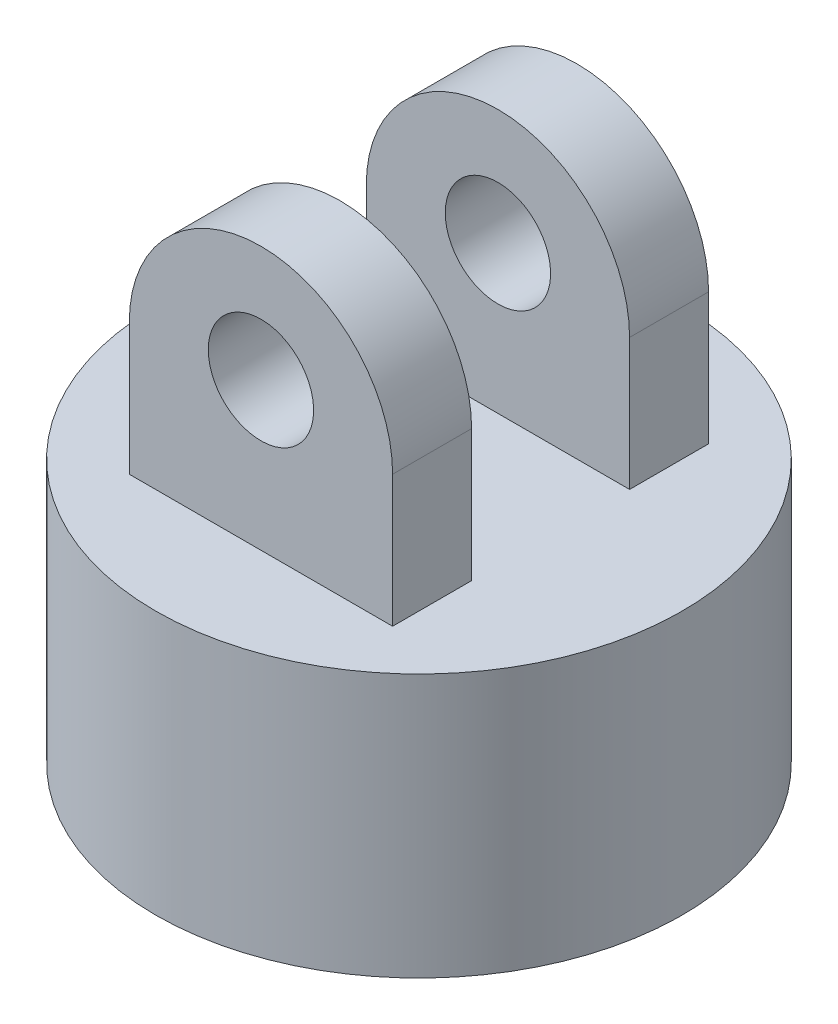
ISO-10303-21;
HEADER;
FILE_DESCRIPTION(('STEP AP214'),'2;1');
FILE_NAME('part.step','',(''),(''),'','','');
FILE_SCHEMA(('AUTOMOTIVE_DESIGN { 1 0 10303 214 1 1 1 1 }'));
ENDSEC;
DATA;
#1=APPLICATION_CONTEXT('core data for automotive mechanical design processes');
#2=APPLICATION_PROTOCOL_DEFINITION('international standard','automotive_design',2000,#1);
#3=PRODUCT_CONTEXT('',#1,'mechanical');
#4=PRODUCT('Part','Part','',(#3));
#5=PRODUCT_RELATED_PRODUCT_CATEGORY('part','',(#4));
#6=PRODUCT_DEFINITION_FORMATION('','',#4);
#7=PRODUCT_DEFINITION_CONTEXT('part definition',#1,'design');
#8=PRODUCT_DEFINITION('design','',#6,#7);
#9=PRODUCT_DEFINITION_SHAPE('','',#8);
#10=(LENGTH_UNIT() NAMED_UNIT(*) SI_UNIT(.MILLI.,.METRE.));
#11=(NAMED_UNIT(*) PLANE_ANGLE_UNIT() SI_UNIT($,.RADIAN.));
#12=(NAMED_UNIT(*) SI_UNIT($,.STERADIAN.) SOLID_ANGLE_UNIT());
#13=UNCERTAINTY_MEASURE_WITH_UNIT(LENGTH_MEASURE(1.E-05),#10,'distance_accuracy_value','');
#14=(GEOMETRIC_REPRESENTATION_CONTEXT(3) GLOBAL_UNCERTAINTY_ASSIGNED_CONTEXT((#13)) GLOBAL_UNIT_ASSIGNED_CONTEXT((#10,
#11,#12)) REPRESENTATION_CONTEXT('',''));
#15=CARTESIAN_POINT('',(0.,0.,0.));
#16=DIRECTION('',(0.,0.,1.));
#17=DIRECTION('',(1.,0.,0.));
#18=AXIS2_PLACEMENT_3D('',#15,#16,#17);
#19=CARTESIAN_POINT('',(0.,75.,15.));
#20=DIRECTION('',(0.,0.,-1.));
#21=DIRECTION('',(-1.,0.,0.));
#22=AXIS2_PLACEMENT_3D('',#19,#20,#21);
#23=CYLINDRICAL_SURFACE('',#22,25.);
#24=DIRECTION('',(0.,0.,1.));
#25=VECTOR('',#24,1.);
#26=CARTESIAN_POINT('',(25.,75.,15.));
#27=LINE('',#26,#25);
#28=CARTESIAN_POINT('',(25.,75.,15.));
#29=VERTEX_POINT('',#28);
#30=CARTESIAN_POINT('',(25.,75.,30.));
#31=VERTEX_POINT('',#30);
#32=EDGE_CURVE('E170',#29,#31,#27,.T.);
#33=ORIENTED_EDGE('',*,*,#32,.F.);
#34=CARTESIAN_POINT('',(0.,75.,15.));
#35=DIRECTION('',(0.,0.,1.));
#36=DIRECTION('',(1.,0.,0.));
#37=AXIS2_PLACEMENT_3D('',#34,#35,#36);
#38=CIRCLE('',#37,25.);
#39=CARTESIAN_POINT('',(-25.,75.,15.));
#40=VERTEX_POINT('',#39);
#41=EDGE_CURVE('E46',#40,#29,#38,.F.);
#42=ORIENTED_EDGE('',*,*,#41,.F.);
#43=DIRECTION('',(0.,0.,1.));
#44=VECTOR('',#43,1.);
#45=CARTESIAN_POINT('',(-25.,75.,15.));
#46=LINE('',#45,#44);
#47=CARTESIAN_POINT('',(-25.,75.,30.));
#48=VERTEX_POINT('',#47);
#49=EDGE_CURVE('E107',#48,#40,#46,.F.);
#50=ORIENTED_EDGE('',*,*,#49,.F.);
#51=CARTESIAN_POINT('',(0.,75.,30.));
#52=DIRECTION('',(0.,0.,-1.));
#53=DIRECTION('',(-1.,0.,0.));
#54=AXIS2_PLACEMENT_3D('',#51,#52,#53);
#55=CIRCLE('',#54,25.);
#56=EDGE_CURVE('E11',#31,#48,#55,.F.);
#57=ORIENTED_EDGE('',*,*,#56,.F.);
#58=EDGE_LOOP('',(#33,#42,#50,#57));
#59=FACE_BOUND('',#58,.T.);
#60=ADVANCED_FACE('F38',(#59),#23,.T.);
#61=CARTESIAN_POINT('',(0.,75.,-30.));
#62=DIRECTION('',(0.,0.,-1.));
#63=DIRECTION('',(-1.,0.,0.));
#64=AXIS2_PLACEMENT_3D('',#61,#62,#63);
#65=CYLINDRICAL_SURFACE('',#64,25.);
#66=DIRECTION('',(0.,0.,-1.));
#67=VECTOR('',#66,1.);
#68=CARTESIAN_POINT('',(25.,75.,-30.));
#69=LINE('',#68,#67);
#70=CARTESIAN_POINT('',(25.,75.,-30.));
#71=VERTEX_POINT('',#70);
#72=CARTESIAN_POINT('',(25.,75.,-15.));
#73=VERTEX_POINT('',#72);
#74=EDGE_CURVE('E158',#71,#73,#69,.F.);
#75=ORIENTED_EDGE('',*,*,#74,.F.);
#76=CARTESIAN_POINT('',(0.,75.,-30.));
#77=DIRECTION('',(0.,0.,1.));
#78=DIRECTION('',(1.,0.,0.));
#79=AXIS2_PLACEMENT_3D('',#76,#77,#78);
#80=CIRCLE('',#79,25.);
#81=CARTESIAN_POINT('',(-25.,75.,-30.));
#82=VERTEX_POINT('',#81);
#83=EDGE_CURVE('E166',#82,#71,#80,.F.);
#84=ORIENTED_EDGE('',*,*,#83,.F.);
#85=DIRECTION('',(0.,0.,-1.));
#86=VECTOR('',#85,1.);
#87=CARTESIAN_POINT('',(-25.,75.,-15.));
#88=LINE('',#87,#86);
#89=CARTESIAN_POINT('',(-25.,75.,-15.));
#90=VERTEX_POINT('',#89);
#91=EDGE_CURVE('E163',#90,#82,#88,.T.);
#92=ORIENTED_EDGE('',*,*,#91,.F.);
#93=CARTESIAN_POINT('',(0.,75.,-15.));
#94=DIRECTION('',(0.,0.,-1.));
#95=DIRECTION('',(-1.,0.,0.));
#96=AXIS2_PLACEMENT_3D('',#93,#94,#95);
#97=CIRCLE('',#96,25.);
#98=EDGE_CURVE('E168',#73,#90,#97,.F.);
#99=ORIENTED_EDGE('',*,*,#98,.F.);
#100=EDGE_LOOP('',(#75,#84,#92,#99));
#101=FACE_BOUND('',#100,.T.);
#102=ADVANCED_FACE('F188',(#101),#65,.T.);
#103=CARTESIAN_POINT('',(0.,50.,0.));
#104=DIRECTION('',(0.,1.,0.));
#105=DIRECTION('',(0.,0.,1.));
#106=AXIS2_PLACEMENT_3D('',#103,#104,#105);
#107=PLANE('',#106);
#108=CARTESIAN_POINT('',(0.,50.,0.));
#109=DIRECTION('',(0.,1.,0.));
#110=DIRECTION('',(0.,0.,1.));
#111=AXIS2_PLACEMENT_3D('',#108,#109,#110);
#112=CIRCLE('',#111,50.);
#113=CARTESIAN_POINT('',(0.,50.,50.));
#114=VERTEX_POINT('',#113);
#115=EDGE_CURVE('E155',#114,#114,#112,.T.);
#116=ORIENTED_EDGE('',*,*,#115,.T.);
#117=EDGE_LOOP('',(#116));
#118=FACE_BOUND('',#117,.T.);
#119=DIRECTION('',(1.,0.,0.));
#120=VECTOR('',#119,1.);
#121=CARTESIAN_POINT('',(25.,50.,-15.));
#122=LINE('',#121,#120);
#123=CARTESIAN_POINT('',(-25.,50.,-15.));
#124=VERTEX_POINT('',#123);
#125=CARTESIAN_POINT('',(25.,50.,-15.));
#126=VERTEX_POINT('',#125);
#127=EDGE_CURVE('E137',#124,#126,#122,.T.);
#128=ORIENTED_EDGE('',*,*,#127,.F.);
#129=DIRECTION('',(0.,0.,1.));
#130=VECTOR('',#129,1.);
#131=CARTESIAN_POINT('',(-25.,50.,-15.));
#132=LINE('',#131,#130);
#133=CARTESIAN_POINT('',(-25.,50.,-30.));
#134=VERTEX_POINT('',#133);
#135=EDGE_CURVE('E109',#134,#124,#132,.T.);
#136=ORIENTED_EDGE('',*,*,#135,.F.);
#137=DIRECTION('',(-1.,0.,0.));
#138=VECTOR('',#137,1.);
#139=CARTESIAN_POINT('',(-25.,50.,-30.));
#140=LINE('',#139,#138);
#141=CARTESIAN_POINT('',(25.,50.,-30.));
#142=VERTEX_POINT('',#141);
#143=EDGE_CURVE('E143',#142,#134,#140,.T.);
#144=ORIENTED_EDGE('',*,*,#143,.F.);
#145=DIRECTION('',(0.,0.,-1.));
#146=VECTOR('',#145,1.);
#147=CARTESIAN_POINT('',(25.,50.,-30.));
#148=LINE('',#147,#146);
#149=EDGE_CURVE('E140',#126,#142,#148,.T.);
#150=ORIENTED_EDGE('',*,*,#149,.F.);
#151=EDGE_LOOP('',(#128,#136,#144,#150));
#152=FACE_BOUND('',#151,.T.);
#153=DIRECTION('',(0.,0.,1.));
#154=VECTOR('',#153,1.);
#155=CARTESIAN_POINT('',(-25.,50.,15.));
#156=LINE('',#155,#154);
#157=CARTESIAN_POINT('',(-25.,50.,15.));
#158=VERTEX_POINT('',#157);
#159=CARTESIAN_POINT('',(-25.,50.,30.));
#160=VERTEX_POINT('',#159);
#161=EDGE_CURVE('E105',#158,#160,#156,.T.);
#162=ORIENTED_EDGE('',*,*,#161,.F.);
#163=DIRECTION('',(-1.,0.,0.));
#164=VECTOR('',#163,1.);
#165=CARTESIAN_POINT('',(25.,50.,15.));
#166=LINE('',#165,#164);
#167=CARTESIAN_POINT('',(25.,50.,15.));
#168=VERTEX_POINT('',#167);
#169=EDGE_CURVE('E113',#168,#158,#166,.T.);
#170=ORIENTED_EDGE('',*,*,#169,.F.);
#171=DIRECTION('',(0.,0.,-1.));
#172=VECTOR('',#171,1.);
#173=CARTESIAN_POINT('',(25.,50.,30.));
#174=LINE('',#173,#172);
#175=CARTESIAN_POINT('',(25.,50.,30.));
#176=VERTEX_POINT('',#175);
#177=EDGE_CURVE('E126',#176,#168,#174,.T.);
#178=ORIENTED_EDGE('',*,*,#177,.F.);
#179=DIRECTION('',(1.,0.,0.));
#180=VECTOR('',#179,1.);
#181=CARTESIAN_POINT('',(-25.,50.,30.));
#182=LINE('',#181,#180);
#183=EDGE_CURVE('E124',#160,#176,#182,.T.);
#184=ORIENTED_EDGE('',*,*,#183,.F.);
#185=EDGE_LOOP('',(#162,#170,#178,#184));
#186=FACE_BOUND('',#185,.T.);
#187=ADVANCED_FACE('F122',(#118,#152,#186),#107,.T.);
#188=CARTESIAN_POINT('',(0.,50.,0.));
#189=DIRECTION('',(0.,-1.,0.));
#190=DIRECTION('',(0.,0.,-1.));
#191=AXIS2_PLACEMENT_3D('',#188,#189,#190);
#192=CYLINDRICAL_SURFACE('',#191,50.);
#193=ORIENTED_EDGE('',*,*,#115,.F.);
#194=EDGE_LOOP('',(#193));
#195=FACE_BOUND('',#194,.T.);
#196=CARTESIAN_POINT('',(0.,0.,0.));
#197=DIRECTION('',(0.,1.,0.));
#198=DIRECTION('',(0.,0.,1.));
#199=AXIS2_PLACEMENT_3D('',#196,#197,#198);
#200=CIRCLE('',#199,50.);
#201=CARTESIAN_POINT('',(0.,0.,50.));
#202=VERTEX_POINT('',#201);
#203=EDGE_CURVE('E154',#202,#202,#200,.T.);
#204=ORIENTED_EDGE('',*,*,#203,.T.);
#205=EDGE_LOOP('',(#204));
#206=FACE_BOUND('',#205,.T.);
#207=ADVANCED_FACE('F196',(#195,#206),#192,.T.);
#208=CARTESIAN_POINT('',(0.,0.,0.));
#209=DIRECTION('',(0.,1.,0.));
#210=DIRECTION('',(0.,0.,1.));
#211=AXIS2_PLACEMENT_3D('',#208,#209,#210);
#212=PLANE('',#211);
#213=ORIENTED_EDGE('',*,*,#203,.F.);
#214=EDGE_LOOP('',(#213));
#215=FACE_BOUND('',#214,.T.);
#216=ADVANCED_FACE('F206',(#215),#212,.F.);
#217=CARTESIAN_POINT('',(-25.,100.,-15.));
#218=DIRECTION('',(1.,0.,0.));
#219=DIRECTION('',(0.,0.,-1.));
#220=AXIS2_PLACEMENT_3D('',#217,#218,#219);
#221=PLANE('',#220);
#222=DIRECTION('',(0.,-1.,0.));
#223=VECTOR('',#222,1.);
#224=CARTESIAN_POINT('',(-25.,100.,-15.));
#225=LINE('',#224,#223);
#226=EDGE_CURVE('E152',#90,#124,#225,.T.);
#227=ORIENTED_EDGE('',*,*,#226,.F.);
#228=ORIENTED_EDGE('',*,*,#91,.T.);
#229=DIRECTION('',(0.,-1.,0.));
#230=VECTOR('',#229,1.);
#231=CARTESIAN_POINT('',(-25.,100.,-30.));
#232=LINE('',#231,#230);
#233=EDGE_CURVE('E146',#82,#134,#232,.T.);
#234=ORIENTED_EDGE('',*,*,#233,.T.);
#235=ORIENTED_EDGE('',*,*,#135,.T.);
#236=EDGE_LOOP('',(#227,#228,#234,#235));
#237=FACE_BOUND('',#236,.T.);
#238=ADVANCED_FACE('F209',(#237),#221,.F.);
#239=CARTESIAN_POINT('',(25.,100.,-15.));
#240=DIRECTION('',(0.,0.,-1.));
#241=DIRECTION('',(-1.,0.,0.));
#242=AXIS2_PLACEMENT_3D('',#239,#240,#241);
#243=PLANE('',#242);
#244=CARTESIAN_POINT('',(0.,78.,-15.));
#245=DIRECTION('',(0.,0.,-1.));
#246=DIRECTION('',(-1.,0.,0.));
#247=AXIS2_PLACEMENT_3D('',#244,#245,#246);
#248=CIRCLE('',#247,10.);
#249=CARTESIAN_POINT('',(-9.99999999999999,78.,-15.));
#250=VERTEX_POINT('',#249);
#251=EDGE_CURVE('E120',#250,#250,#248,.T.);
#252=ORIENTED_EDGE('',*,*,#251,.T.);
#253=EDGE_LOOP('',(#252));
#254=FACE_BOUND('',#253,.T.);
#255=DIRECTION('',(0.,-1.,0.));
#256=VECTOR('',#255,1.);
#257=CARTESIAN_POINT('',(25.,100.,-15.));
#258=LINE('',#257,#256);
#259=EDGE_CURVE('E150',#73,#126,#258,.T.);
#260=ORIENTED_EDGE('',*,*,#259,.F.);
#261=ORIENTED_EDGE('',*,*,#98,.T.);
#262=ORIENTED_EDGE('',*,*,#226,.T.);
#263=ORIENTED_EDGE('',*,*,#127,.T.);
#264=EDGE_LOOP('',(#260,#261,#262,#263));
#265=FACE_BOUND('',#264,.T.);
#266=ADVANCED_FACE('F214',(#254,#265),#243,.F.);
#267=CARTESIAN_POINT('',(25.,100.,-30.));
#268=DIRECTION('',(-1.,0.,0.));
#269=DIRECTION('',(0.,0.,1.));
#270=AXIS2_PLACEMENT_3D('',#267,#268,#269);
#271=PLANE('',#270);
#272=DIRECTION('',(0.,-1.,0.));
#273=VECTOR('',#272,1.);
#274=CARTESIAN_POINT('',(25.,100.,-30.));
#275=LINE('',#274,#273);
#276=EDGE_CURVE('E148',#71,#142,#275,.T.);
#277=ORIENTED_EDGE('',*,*,#276,.F.);
#278=ORIENTED_EDGE('',*,*,#74,.T.);
#279=ORIENTED_EDGE('',*,*,#259,.T.);
#280=ORIENTED_EDGE('',*,*,#149,.T.);
#281=EDGE_LOOP('',(#277,#278,#279,#280));
#282=FACE_BOUND('',#281,.T.);
#283=ADVANCED_FACE('F218',(#282),#271,.F.);
#284=CARTESIAN_POINT('',(-25.,100.,-30.));
#285=DIRECTION('',(0.,0.,1.));
#286=DIRECTION('',(1.,0.,0.));
#287=AXIS2_PLACEMENT_3D('',#284,#285,#286);
#288=PLANE('',#287);
#289=CARTESIAN_POINT('',(0.,78.,-30.));
#290=DIRECTION('',(0.,0.,-1.));
#291=DIRECTION('',(-1.,0.,0.));
#292=AXIS2_PLACEMENT_3D('',#289,#290,#291);
#293=CIRCLE('',#292,10.);
#294=CARTESIAN_POINT('',(-9.99999999999999,78.,-30.));
#295=VERTEX_POINT('',#294);
#296=EDGE_CURVE('E238',#295,#295,#293,.T.);
#297=ORIENTED_EDGE('',*,*,#296,.F.);
#298=EDGE_LOOP('',(#297));
#299=FACE_BOUND('',#298,.T.);
#300=ORIENTED_EDGE('',*,*,#233,.F.);
#301=ORIENTED_EDGE('',*,*,#83,.T.);
#302=ORIENTED_EDGE('',*,*,#276,.T.);
#303=ORIENTED_EDGE('',*,*,#143,.T.);
#304=EDGE_LOOP('',(#300,#301,#302,#303));
#305=FACE_BOUND('',#304,.T.);
#306=ADVANCED_FACE('F222',(#299,#305),#288,.F.);
#307=CARTESIAN_POINT('',(25.,100.,15.));
#308=DIRECTION('',(0.,0.,1.));
#309=DIRECTION('',(1.,0.,0.));
#310=AXIS2_PLACEMENT_3D('',#307,#308,#309);
#311=PLANE('',#310);
#312=CARTESIAN_POINT('',(0.,78.,15.));
#313=DIRECTION('',(0.,0.,1.));
#314=DIRECTION('',(1.,0.,0.));
#315=AXIS2_PLACEMENT_3D('',#312,#313,#314);
#316=CIRCLE('',#315,10.);
#317=CARTESIAN_POINT('',(10.,78.,15.));
#318=VERTEX_POINT('',#317);
#319=EDGE_CURVE('E233',#318,#318,#316,.T.);
#320=ORIENTED_EDGE('',*,*,#319,.T.);
#321=EDGE_LOOP('',(#320));
#322=FACE_BOUND('',#321,.T.);
#323=DIRECTION('',(0.,-1.,0.));
#324=VECTOR('',#323,1.);
#325=CARTESIAN_POINT('',(-25.,100.,15.));
#326=LINE('',#325,#324);
#327=EDGE_CURVE('E100',#40,#158,#326,.T.);
#328=ORIENTED_EDGE('',*,*,#327,.F.);
#329=ORIENTED_EDGE('',*,*,#41,.T.);
#330=DIRECTION('',(0.,-1.,0.));
#331=VECTOR('',#330,1.);
#332=CARTESIAN_POINT('',(25.,100.,15.));
#333=LINE('',#332,#331);
#334=EDGE_CURVE('E116',#29,#168,#333,.T.);
#335=ORIENTED_EDGE('',*,*,#334,.T.);
#336=ORIENTED_EDGE('',*,*,#169,.T.);
#337=EDGE_LOOP('',(#328,#329,#335,#336));
#338=FACE_BOUND('',#337,.T.);
#339=ADVANCED_FACE('F114',(#322,#338),#311,.F.);
#340=CARTESIAN_POINT('',(-25.,100.,15.));
#341=DIRECTION('',(1.,0.,0.));
#342=DIRECTION('',(0.,0.,-1.));
#343=AXIS2_PLACEMENT_3D('',#340,#341,#342);
#344=PLANE('',#343);
#345=DIRECTION('',(0.,-1.,0.));
#346=VECTOR('',#345,1.);
#347=CARTESIAN_POINT('',(-25.,100.,30.));
#348=LINE('',#347,#346);
#349=EDGE_CURVE('E110',#48,#160,#348,.T.);
#350=ORIENTED_EDGE('',*,*,#349,.F.);
#351=ORIENTED_EDGE('',*,*,#49,.T.);
#352=ORIENTED_EDGE('',*,*,#327,.T.);
#353=ORIENTED_EDGE('',*,*,#161,.T.);
#354=EDGE_LOOP('',(#350,#351,#352,#353));
#355=FACE_BOUND('',#354,.T.);
#356=ADVANCED_FACE('F103',(#355),#344,.F.);
#357=CARTESIAN_POINT('',(-25.,100.,30.));
#358=DIRECTION('',(0.,0.,-1.));
#359=DIRECTION('',(-1.,0.,0.));
#360=AXIS2_PLACEMENT_3D('',#357,#358,#359);
#361=PLANE('',#360);
#362=CARTESIAN_POINT('',(0.,78.,30.));
#363=DIRECTION('',(0.,0.,-1.));
#364=DIRECTION('',(-1.,0.,0.));
#365=AXIS2_PLACEMENT_3D('',#362,#363,#364);
#366=CIRCLE('',#365,10.);
#367=CARTESIAN_POINT('',(-9.99999999999999,78.,30.));
#368=VERTEX_POINT('',#367);
#369=EDGE_CURVE('E235',#368,#368,#366,.T.);
#370=ORIENTED_EDGE('',*,*,#369,.T.);
#371=EDGE_LOOP('',(#370));
#372=FACE_BOUND('',#371,.T.);
#373=DIRECTION('',(0.,-1.,0.));
#374=VECTOR('',#373,1.);
#375=CARTESIAN_POINT('',(25.,100.,30.));
#376=LINE('',#375,#374);
#377=EDGE_CURVE('E132',#31,#176,#376,.T.);
#378=ORIENTED_EDGE('',*,*,#377,.F.);
#379=ORIENTED_EDGE('',*,*,#56,.T.);
#380=ORIENTED_EDGE('',*,*,#349,.T.);
#381=ORIENTED_EDGE('',*,*,#183,.T.);
#382=EDGE_LOOP('',(#378,#379,#380,#381));
#383=FACE_BOUND('',#382,.T.);
#384=ADVANCED_FACE('F175',(#372,#383),#361,.F.);
#385=CARTESIAN_POINT('',(25.,100.,30.));
#386=DIRECTION('',(-1.,0.,0.));
#387=DIRECTION('',(0.,0.,1.));
#388=AXIS2_PLACEMENT_3D('',#385,#386,#387);
#389=PLANE('',#388);
#390=ORIENTED_EDGE('',*,*,#334,.F.);
#391=ORIENTED_EDGE('',*,*,#32,.T.);
#392=ORIENTED_EDGE('',*,*,#377,.T.);
#393=ORIENTED_EDGE('',*,*,#177,.T.);
#394=EDGE_LOOP('',(#390,#391,#392,#393));
#395=FACE_BOUND('',#394,.T.);
#396=ADVANCED_FACE('F174',(#395),#389,.F.);
#397=CARTESIAN_POINT('',(0.,78.,30.));
#398=DIRECTION('',(0.,0.,-1.));
#399=DIRECTION('',(-1.,0.,0.));
#400=AXIS2_PLACEMENT_3D('',#397,#398,#399);
#401=CYLINDRICAL_SURFACE('',#400,10.);
#402=ORIENTED_EDGE('',*,*,#369,.F.);
#403=EDGE_LOOP('',(#402));
#404=FACE_BOUND('',#403,.T.);
#405=ORIENTED_EDGE('',*,*,#319,.F.);
#406=EDGE_LOOP('',(#405));
#407=FACE_BOUND('',#406,.T.);
#408=ADVANCED_FACE('F183',(#404,#407),#401,.F.);
#409=ORIENTED_EDGE('',*,*,#296,.T.);
#410=EDGE_LOOP('',(#409));
#411=FACE_BOUND('',#410,.T.);
#412=ORIENTED_EDGE('',*,*,#251,.F.);
#413=EDGE_LOOP('',(#412));
#414=FACE_BOUND('',#413,.T.);
#415=ADVANCED_FACE('F244',(#411,#414),#401,.F.);
#416=CLOSED_SHELL('',(#60,#102,#187,#207,#216,#238,#266,#283,#306,#339,#356,#384,#396,#408,#415));
#417=MANIFOLD_SOLID_BREP('B2',#416);
#418=ADVANCED_BREP_SHAPE_REPRESENTATION('',(#18,#417),#14);
#419=SHAPE_DEFINITION_REPRESENTATION(#9,#418);
ENDSEC;
END-ISO-10303-21;
